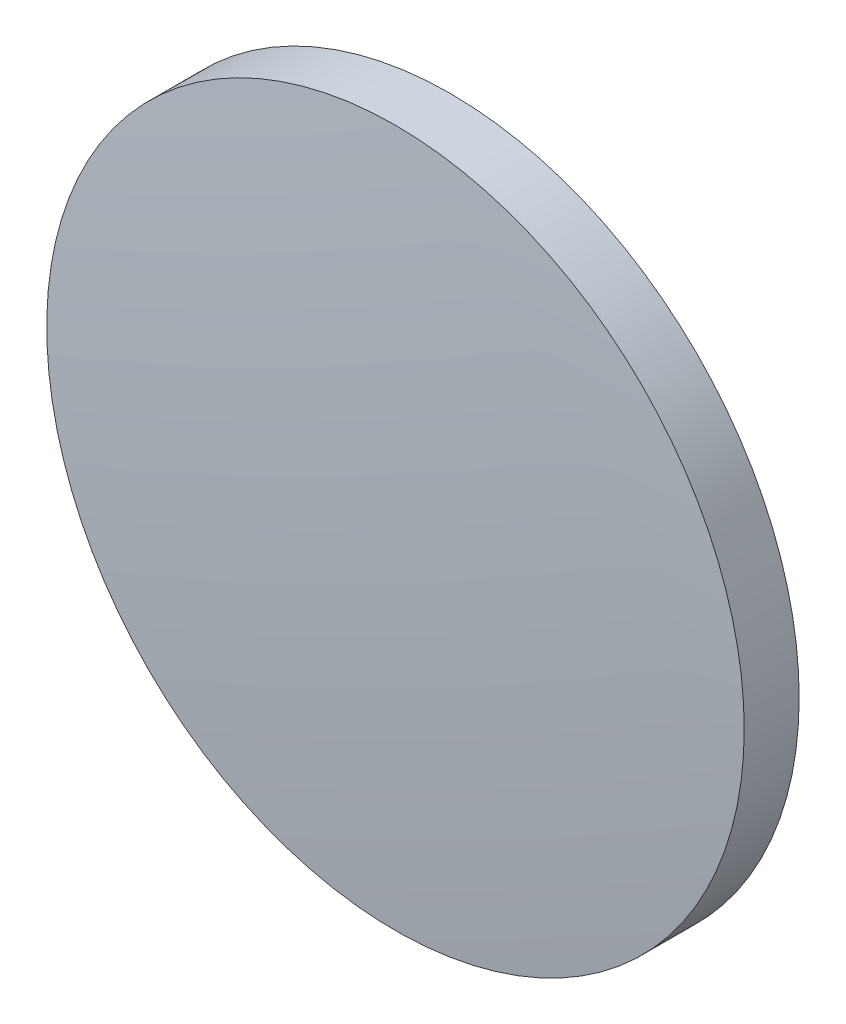
ISO-10303-21;
HEADER;
FILE_DESCRIPTION(('STEP AP214'),'2;1');
FILE_NAME('part.step','',(''),(''),'','','');
FILE_SCHEMA(('AUTOMOTIVE_DESIGN { 1 0 10303 214 1 1 1 1 }'));
ENDSEC;
DATA;
#1=APPLICATION_CONTEXT('core data for automotive mechanical design processes');
#2=APPLICATION_PROTOCOL_DEFINITION('international standard','automotive_design',2000,#1);
#3=PRODUCT_CONTEXT('',#1,'mechanical');
#4=PRODUCT('Part','Part','',(#3));
#5=PRODUCT_RELATED_PRODUCT_CATEGORY('part','',(#4));
#6=PRODUCT_DEFINITION_FORMATION('','',#4);
#7=PRODUCT_DEFINITION_CONTEXT('part definition',#1,'design');
#8=PRODUCT_DEFINITION('design','',#6,#7);
#9=PRODUCT_DEFINITION_SHAPE('','',#8);
#10=(LENGTH_UNIT() NAMED_UNIT(*) SI_UNIT(.MILLI.,.METRE.));
#11=(NAMED_UNIT(*) PLANE_ANGLE_UNIT() SI_UNIT($,.RADIAN.));
#12=(NAMED_UNIT(*) SI_UNIT($,.STERADIAN.) SOLID_ANGLE_UNIT());
#13=UNCERTAINTY_MEASURE_WITH_UNIT(LENGTH_MEASURE(1.E-05),#10,'distance_accuracy_value','');
#14=(GEOMETRIC_REPRESENTATION_CONTEXT(3) GLOBAL_UNCERTAINTY_ASSIGNED_CONTEXT((#13)) GLOBAL_UNIT_ASSIGNED_CONTEXT((#10,
#11,#12)) REPRESENTATION_CONTEXT('',''));
#15=CARTESIAN_POINT('',(0.,0.,0.));
#16=DIRECTION('',(0.,0.,1.));
#17=DIRECTION('',(1.,0.,0.));
#18=AXIS2_PLACEMENT_3D('',#15,#16,#17);
#19=CARTESIAN_POINT('',(0.,0.,152.475));
#20=DIRECTION('',(0.,0.,1.));
#21=DIRECTION('',(0.,1.,0.));
#22=AXIS2_PLACEMENT_3D('',#19,#20,#21);
#23=SPHERICAL_SURFACE('',#22,154.);
#24=CARTESIAN_POINT('',(0.,0.,-1.00043777425753));
#25=DIRECTION('',(0.,0.,1.));
#26=DIRECTION('',(1.,0.,0.));
#27=AXIS2_PLACEMENT_3D('',#24,#25,#26);
#28=CIRCLE('',#27,12.7);
#29=CARTESIAN_POINT('',(12.7,0.,-1.00043777425753));
#30=VERTEX_POINT('',#29);
#31=EDGE_CURVE('E10',#30,#30,#28,.T.);
#32=ORIENTED_EDGE('',*,*,#31,.F.);
#33=EDGE_LOOP('',(#32));
#34=FACE_BOUND('',#33,.T.);
#35=ADVANCED_FACE('F14',(#34),#23,.T.);
#36=CARTESIAN_POINT('',(0.,0.,6.49100038893206));
#37=DIRECTION('',(0.,0.,1.));
#38=DIRECTION('',(1.,0.,0.));
#39=AXIS2_PLACEMENT_3D('',#36,#37,#38);
#40=CYLINDRICAL_SURFACE('',#39,12.7);
#41=CARTESIAN_POINT('',(0.,0.,1.00043777425754));
#42=DIRECTION('',(0.,0.,1.));
#43=DIRECTION('',(1.,0.,0.));
#44=AXIS2_PLACEMENT_3D('',#41,#42,#43);
#45=CIRCLE('',#44,12.7);
#46=CARTESIAN_POINT('',(12.7,0.,1.00043777425754));
#47=VERTEX_POINT('',#46);
#48=EDGE_CURVE('E20',#47,#47,#45,.T.);
#49=ORIENTED_EDGE('',*,*,#48,.F.);
#50=EDGE_LOOP('',(#49));
#51=FACE_BOUND('',#50,.T.);
#52=ORIENTED_EDGE('',*,*,#31,.T.);
#53=EDGE_LOOP('',(#52));
#54=FACE_BOUND('',#53,.T.);
#55=ADVANCED_FACE('F28',(#51,#54),#40,.T.);
#56=CARTESIAN_POINT('',(0.,0.,-152.475));
#57=DIRECTION('',(0.,0.,1.));
#58=DIRECTION('',(0.,1.,0.));
#59=AXIS2_PLACEMENT_3D('',#56,#57,#58);
#60=SPHERICAL_SURFACE('',#59,154.);
#61=ORIENTED_EDGE('',*,*,#48,.T.);
#62=EDGE_LOOP('',(#61));
#63=FACE_BOUND('',#62,.T.);
#64=ADVANCED_FACE('F26',(#63),#60,.T.);
#65=CLOSED_SHELL('',(#35,#55,#64));
#66=MANIFOLD_SOLID_BREP('B1',#65);
#67=ADVANCED_BREP_SHAPE_REPRESENTATION('',(#18,#66),#14);
#68=SHAPE_DEFINITION_REPRESENTATION(#9,#67);
ENDSEC;
END-ISO-10303-21;
